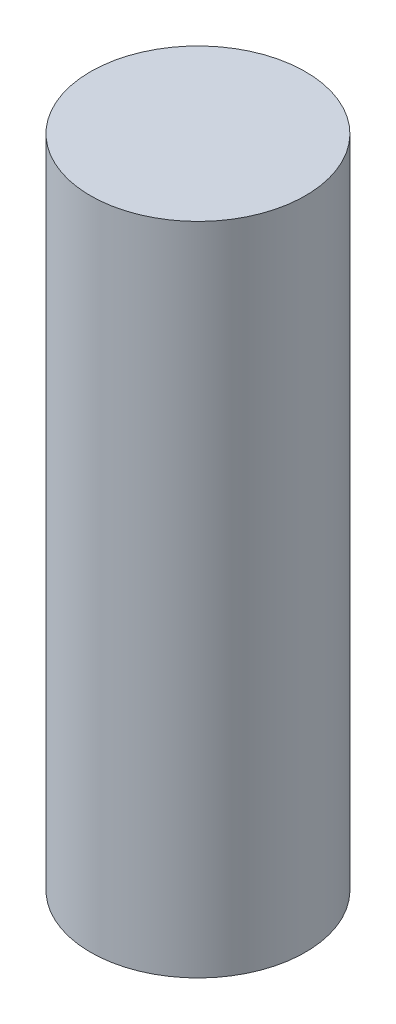
ISO-10303-21;
HEADER;
FILE_DESCRIPTION(('STEP AP214'),'2;1');
FILE_NAME('part.step','',(''),(''),'','','');
FILE_SCHEMA(('AUTOMOTIVE_DESIGN { 1 0 10303 214 1 1 1 1 }'));
ENDSEC;
DATA;
#1=APPLICATION_CONTEXT('core data for automotive mechanical design processes');
#2=APPLICATION_PROTOCOL_DEFINITION('international standard','automotive_design',2000,#1);
#3=PRODUCT_CONTEXT('',#1,'mechanical');
#4=PRODUCT('Part','Part','',(#3));
#5=PRODUCT_RELATED_PRODUCT_CATEGORY('part','',(#4));
#6=PRODUCT_DEFINITION_FORMATION('','',#4);
#7=PRODUCT_DEFINITION_CONTEXT('part definition',#1,'design');
#8=PRODUCT_DEFINITION('design','',#6,#7);
#9=PRODUCT_DEFINITION_SHAPE('','',#8);
#10=(LENGTH_UNIT() NAMED_UNIT(*) SI_UNIT(.MILLI.,.METRE.));
#11=(NAMED_UNIT(*) PLANE_ANGLE_UNIT() SI_UNIT($,.RADIAN.));
#12=(NAMED_UNIT(*) SI_UNIT($,.STERADIAN.) SOLID_ANGLE_UNIT());
#13=UNCERTAINTY_MEASURE_WITH_UNIT(LENGTH_MEASURE(1.E-05),#10,'distance_accuracy_value','');
#14=(GEOMETRIC_REPRESENTATION_CONTEXT(3) GLOBAL_UNCERTAINTY_ASSIGNED_CONTEXT((#13)) GLOBAL_UNIT_ASSIGNED_CONTEXT((#10,
#11,#12)) REPRESENTATION_CONTEXT('',''));
#15=CARTESIAN_POINT('',(0.,0.,0.));
#16=DIRECTION('',(0.,0.,1.));
#17=DIRECTION('',(1.,0.,0.));
#18=AXIS2_PLACEMENT_3D('',#15,#16,#17);
#19=CARTESIAN_POINT('',(2.6494332228303,34.2143632558561,0.));
#20=DIRECTION('',(0.,1.,0.));
#21=DIRECTION('',(-1.,0.,0.));
#22=AXIS2_PLACEMENT_3D('',#19,#20,#21);
#23=CYLINDRICAL_SURFACE('',#22,6.);
#24=CARTESIAN_POINT('',(2.6494332228303,-2.36049658425541,0.));
#25=DIRECTION('',(0.,1.,0.));
#26=DIRECTION('',(-1.,0.,0.));
#27=AXIS2_PLACEMENT_3D('',#24,#25,#26);
#28=CIRCLE('',#27,6.);
#29=CARTESIAN_POINT('',(-3.3505667771697,-2.36049658425541,0.));
#30=VERTEX_POINT('',#29);
#31=EDGE_CURVE('E37',#30,#30,#28,.T.);
#32=ORIENTED_EDGE('',*,*,#31,.T.);
#33=EDGE_LOOP('',(#32));
#34=FACE_BOUND('',#33,.T.);
#35=CARTESIAN_POINT('',(2.6494332228303,34.2143632558561,0.));
#36=DIRECTION('',(0.,1.,0.));
#37=DIRECTION('',(-1.,0.,0.));
#38=AXIS2_PLACEMENT_3D('',#35,#36,#37);
#39=CIRCLE('',#38,6.00000000000001);
#40=CARTESIAN_POINT('',(-3.35056677716971,34.2143632558561,0.));
#41=VERTEX_POINT('',#40);
#42=EDGE_CURVE('E10',#41,#41,#39,.T.);
#43=ORIENTED_EDGE('',*,*,#42,.F.);
#44=EDGE_LOOP('',(#43));
#45=FACE_BOUND('',#44,.T.);
#46=ADVANCED_FACE('F31',(#34,#45),#23,.T.);
#47=CARTESIAN_POINT('',(2.6494332228303,34.2143632558561,0.));
#48=DIRECTION('',(0.,-1.,0.));
#49=DIRECTION('',(1.,0.,0.));
#50=AXIS2_PLACEMENT_3D('',#47,#48,#49);
#51=PLANE('',#50);
#52=ORIENTED_EDGE('',*,*,#42,.T.);
#53=EDGE_LOOP('',(#52));
#54=FACE_BOUND('',#53,.T.);
#55=ADVANCED_FACE('F47',(#54),#51,.F.);
#56=CARTESIAN_POINT('',(2.6494332228303,-2.36049658425541,0.));
#57=DIRECTION('',(0.,1.,0.));
#58=DIRECTION('',(-1.,0.,0.));
#59=AXIS2_PLACEMENT_3D('',#56,#57,#58);
#60=PLANE('',#59);
#61=ORIENTED_EDGE('',*,*,#31,.F.);
#62=EDGE_LOOP('',(#61));
#63=FACE_BOUND('',#62,.T.);
#64=ADVANCED_FACE('F45',(#63),#60,.F.);
#65=CLOSED_SHELL('',(#46,#55,#64));
#66=MANIFOLD_SOLID_BREP('B2',#65);
#67=ADVANCED_BREP_SHAPE_REPRESENTATION('',(#18,#66),#14);
#68=SHAPE_DEFINITION_REPRESENTATION(#9,#67);
ENDSEC;
END-ISO-10303-21;
